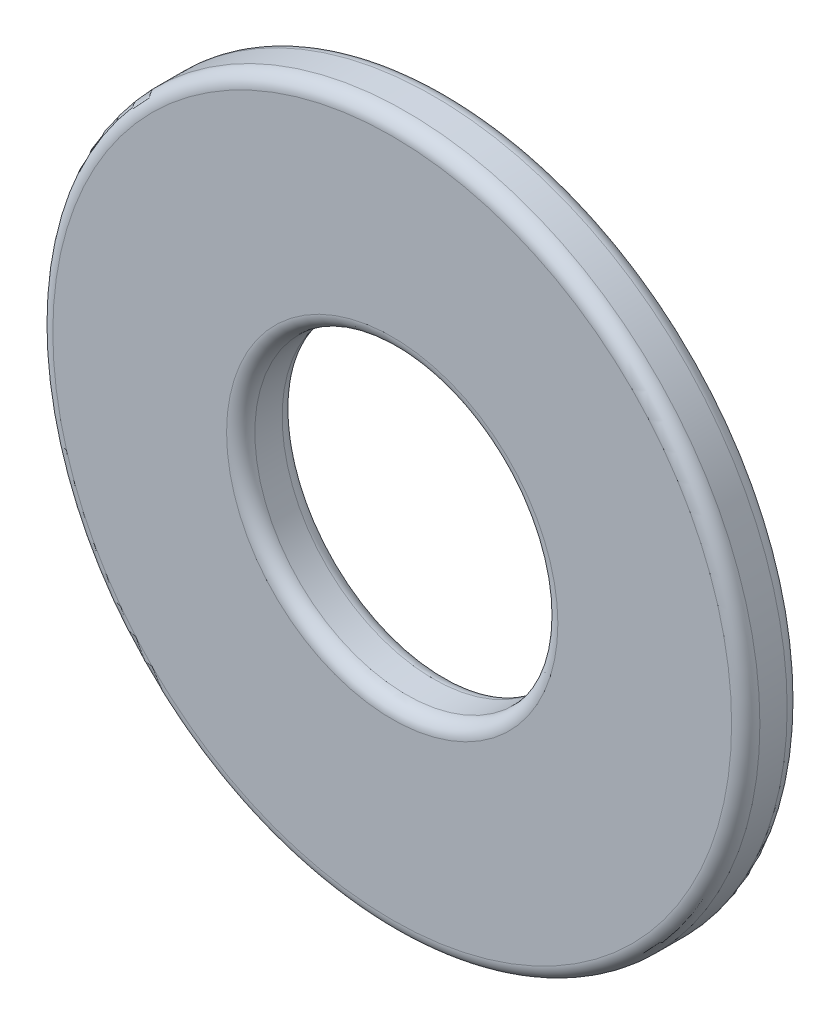
ISO-10303-21;
HEADER;
FILE_DESCRIPTION(('STEP AP214'),'2;1');
FILE_NAME('part.step','',(''),(''),'','','');
FILE_SCHEMA(('AUTOMOTIVE_DESIGN { 1 0 10303 214 1 1 1 1 }'));
ENDSEC;
DATA;
#1=APPLICATION_CONTEXT('core data for automotive mechanical design processes');
#2=APPLICATION_PROTOCOL_DEFINITION('international standard','automotive_design',2000,#1);
#3=PRODUCT_CONTEXT('',#1,'mechanical');
#4=PRODUCT('Part','Part','',(#3));
#5=PRODUCT_RELATED_PRODUCT_CATEGORY('part','',(#4));
#6=PRODUCT_DEFINITION_FORMATION('','',#4);
#7=PRODUCT_DEFINITION_CONTEXT('part definition',#1,'design');
#8=PRODUCT_DEFINITION('design','',#6,#7);
#9=PRODUCT_DEFINITION_SHAPE('','',#8);
#10=(LENGTH_UNIT() NAMED_UNIT(*) SI_UNIT(.MILLI.,.METRE.));
#11=(NAMED_UNIT(*) PLANE_ANGLE_UNIT() SI_UNIT($,.RADIAN.));
#12=(NAMED_UNIT(*) SI_UNIT($,.STERADIAN.) SOLID_ANGLE_UNIT());
#13=UNCERTAINTY_MEASURE_WITH_UNIT(LENGTH_MEASURE(1.E-05),#10,'distance_accuracy_value','');
#14=(GEOMETRIC_REPRESENTATION_CONTEXT(3) GLOBAL_UNCERTAINTY_ASSIGNED_CONTEXT((#13)) GLOBAL_UNIT_ASSIGNED_CONTEXT((#10,
#11,#12)) REPRESENTATION_CONTEXT('',''));
#15=CARTESIAN_POINT('',(0.,0.,0.));
#16=DIRECTION('',(0.,0.,1.));
#17=DIRECTION('',(1.,0.,0.));
#18=AXIS2_PLACEMENT_3D('',#15,#16,#17);
#19=CARTESIAN_POINT('',(0.,0.,-0.275));
#20=DIRECTION('',(0.,0.,1.));
#21=DIRECTION('',(1.,0.,0.));
#22=AXIS2_PLACEMENT_3D('',#19,#20,#21);
#23=CYLINDRICAL_SURFACE('',#22,3.5);
#24=CARTESIAN_POINT('',(0.,0.,-0.135));
#25=DIRECTION('',(0.,0.,1.));
#26=DIRECTION('',(1.,0.,0.));
#27=AXIS2_PLACEMENT_3D('',#24,#25,#26);
#28=CIRCLE('',#27,3.5);
#29=CARTESIAN_POINT('',(3.5,0.,-0.135));
#30=VERTEX_POINT('',#29);
#31=EDGE_CURVE('E11',#30,#30,#28,.T.);
#32=ORIENTED_EDGE('',*,*,#31,.T.);
#33=EDGE_LOOP('',(#32));
#34=FACE_BOUND('',#33,.T.);
#35=CARTESIAN_POINT('',(0.,0.,0.135));
#36=DIRECTION('',(0.,0.,1.));
#37=DIRECTION('',(1.,0.,0.));
#38=AXIS2_PLACEMENT_3D('',#35,#36,#37);
#39=CIRCLE('',#38,3.5);
#40=CARTESIAN_POINT('',(3.5,0.,0.135));
#41=VERTEX_POINT('',#40);
#42=EDGE_CURVE('E162',#41,#41,#39,.F.);
#43=ORIENTED_EDGE('',*,*,#42,.T.);
#44=EDGE_LOOP('',(#43));
#45=FACE_BOUND('',#44,.T.);
#46=ADVANCED_FACE('F154',(#34,#45),#23,.T.);
#47=CARTESIAN_POINT('',(0.,0.,-0.275));
#48=DIRECTION('',(0.,0.,1.));
#49=DIRECTION('',(1.,0.,0.));
#50=AXIS2_PLACEMENT_3D('',#47,#48,#49);
#51=PLANE('',#50);
#52=CARTESIAN_POINT('',(0.,0.,-0.275));
#53=DIRECTION('',(0.,0.,1.));
#54=DIRECTION('',(1.,0.,0.));
#55=AXIS2_PLACEMENT_3D('',#52,#53,#54);
#56=CIRCLE('',#55,1.64);
#57=CARTESIAN_POINT('',(1.64,0.,-0.275));
#58=VERTEX_POINT('',#57);
#59=EDGE_CURVE('E168',#58,#58,#56,.T.);
#60=ORIENTED_EDGE('',*,*,#59,.T.);
#61=EDGE_LOOP('',(#60));
#62=FACE_BOUND('',#61,.T.);
#63=CARTESIAN_POINT('',(0.,0.,-0.275));
#64=DIRECTION('',(0.,0.,1.));
#65=DIRECTION('',(1.,0.,0.));
#66=AXIS2_PLACEMENT_3D('',#63,#64,#65);
#67=CIRCLE('',#66,3.36);
#68=CARTESIAN_POINT('',(3.36,0.,-0.275));
#69=VERTEX_POINT('',#68);
#70=EDGE_CURVE('E174',#69,#69,#67,.F.);
#71=ORIENTED_EDGE('',*,*,#70,.T.);
#72=EDGE_LOOP('',(#71));
#73=FACE_BOUND('',#72,.T.);
#74=ADVANCED_FACE('F208',(#62,#73),#51,.F.);
#75=CARTESIAN_POINT('',(0.,0.,-0.275));
#76=DIRECTION('',(0.,0.,1.));
#77=DIRECTION('',(1.,0.,0.));
#78=AXIS2_PLACEMENT_3D('',#75,#76,#77);
#79=CYLINDRICAL_SURFACE('',#78,1.5);
#80=CARTESIAN_POINT('',(0.,0.,0.135));
#81=DIRECTION('',(0.,0.,1.));
#82=DIRECTION('',(1.,0.,0.));
#83=AXIS2_PLACEMENT_3D('',#80,#81,#82);
#84=CIRCLE('',#83,1.5);
#85=CARTESIAN_POINT('',(1.5,0.,0.135));
#86=VERTEX_POINT('',#85);
#87=EDGE_CURVE('E188',#86,#86,#84,.T.);
#88=ORIENTED_EDGE('',*,*,#87,.T.);
#89=EDGE_LOOP('',(#88));
#90=FACE_BOUND('',#89,.T.);
#91=CARTESIAN_POINT('',(0.,0.,-0.135));
#92=DIRECTION('',(0.,0.,1.));
#93=DIRECTION('',(1.,0.,0.));
#94=AXIS2_PLACEMENT_3D('',#91,#92,#93);
#95=CIRCLE('',#94,1.5);
#96=CARTESIAN_POINT('',(1.5,0.,-0.135));
#97=VERTEX_POINT('',#96);
#98=EDGE_CURVE('E192',#97,#97,#95,.F.);
#99=ORIENTED_EDGE('',*,*,#98,.T.);
#100=EDGE_LOOP('',(#99));
#101=FACE_BOUND('',#100,.T.);
#102=ADVANCED_FACE('F198',(#90,#101),#79,.F.);
#103=CARTESIAN_POINT('',(0.,0.,0.275));
#104=DIRECTION('',(0.,0.,1.));
#105=DIRECTION('',(1.,0.,0.));
#106=AXIS2_PLACEMENT_3D('',#103,#104,#105);
#107=PLANE('',#106);
#108=CARTESIAN_POINT('',(0.,0.,0.275));
#109=DIRECTION('',(0.,0.,1.));
#110=DIRECTION('',(1.,0.,0.));
#111=AXIS2_PLACEMENT_3D('',#108,#109,#110);
#112=CIRCLE('',#111,1.64);
#113=CARTESIAN_POINT('',(1.64,0.,0.275));
#114=VERTEX_POINT('',#113);
#115=EDGE_CURVE('E180',#114,#114,#112,.F.);
#116=ORIENTED_EDGE('',*,*,#115,.T.);
#117=EDGE_LOOP('',(#116));
#118=FACE_BOUND('',#117,.T.);
#119=CARTESIAN_POINT('',(0.,0.,0.275));
#120=DIRECTION('',(0.,0.,1.));
#121=DIRECTION('',(1.,0.,0.));
#122=AXIS2_PLACEMENT_3D('',#119,#120,#121);
#123=CIRCLE('',#122,3.36);
#124=CARTESIAN_POINT('',(3.36,0.,0.275));
#125=VERTEX_POINT('',#124);
#126=EDGE_CURVE('E184',#125,#125,#123,.T.);
#127=ORIENTED_EDGE('',*,*,#126,.T.);
#128=EDGE_LOOP('',(#127));
#129=FACE_BOUND('',#128,.T.);
#130=ADVANCED_FACE('F227',(#118,#129),#107,.T.);
#131=CARTESIAN_POINT('',(0.,0.,0.135));
#132=DIRECTION('',(0.,0.,1.));
#133=DIRECTION('',(1.,0.,0.));
#134=AXIS2_PLACEMENT_3D('',#131,#132,#133);
#135=TOROIDAL_SURFACE('',#134,1.64,0.14);
#136=ORIENTED_EDGE('',*,*,#115,.F.);
#137=EDGE_LOOP('',(#136));
#138=FACE_BOUND('',#137,.T.);
#139=ORIENTED_EDGE('',*,*,#87,.F.);
#140=EDGE_LOOP('',(#139));
#141=FACE_BOUND('',#140,.T.);
#142=ADVANCED_FACE('F204',(#138,#141),#135,.T.);
#143=CARTESIAN_POINT('',(0.,0.,-0.135));
#144=DIRECTION('',(0.,0.,1.));
#145=DIRECTION('',(1.,0.,0.));
#146=AXIS2_PLACEMENT_3D('',#143,#144,#145);
#147=TOROIDAL_SURFACE('',#146,1.64,0.14);
#148=ORIENTED_EDGE('',*,*,#98,.F.);
#149=EDGE_LOOP('',(#148));
#150=FACE_BOUND('',#149,.T.);
#151=ORIENTED_EDGE('',*,*,#59,.F.);
#152=EDGE_LOOP('',(#151));
#153=FACE_BOUND('',#152,.T.);
#154=ADVANCED_FACE('F200',(#150,#153),#147,.T.);
#155=CARTESIAN_POINT('',(0.,0.,-0.135));
#156=DIRECTION('',(0.,0.,1.));
#157=DIRECTION('',(1.,0.,0.));
#158=AXIS2_PLACEMENT_3D('',#155,#156,#157);
#159=TOROIDAL_SURFACE('',#158,3.36,0.14);
#160=ORIENTED_EDGE('',*,*,#70,.F.);
#161=EDGE_LOOP('',(#160));
#162=FACE_BOUND('',#161,.T.);
#163=ORIENTED_EDGE('',*,*,#31,.F.);
#164=EDGE_LOOP('',(#163));
#165=FACE_BOUND('',#164,.T.);
#166=ADVANCED_FACE('F203',(#162,#165),#159,.T.);
#167=CARTESIAN_POINT('',(0.,0.,0.135));
#168=DIRECTION('',(0.,0.,1.));
#169=DIRECTION('',(1.,0.,0.));
#170=AXIS2_PLACEMENT_3D('',#167,#168,#169);
#171=TOROIDAL_SURFACE('',#170,3.36,0.14);
#172=ORIENTED_EDGE('',*,*,#42,.F.);
#173=EDGE_LOOP('',(#172));
#174=FACE_BOUND('',#173,.T.);
#175=ORIENTED_EDGE('',*,*,#126,.F.);
#176=EDGE_LOOP('',(#175));
#177=FACE_BOUND('',#176,.T.);
#178=ADVANCED_FACE('F156',(#174,#177),#171,.T.);
#179=CLOSED_SHELL('',(#46,#74,#102,#130,#142,#154,#166,#178));
#180=MANIFOLD_SOLID_BREP('B2',#179);
#181=ADVANCED_BREP_SHAPE_REPRESENTATION('',(#18,#180),#14);
#182=SHAPE_DEFINITION_REPRESENTATION(#9,#181);
ENDSEC;
END-ISO-10303-21;
